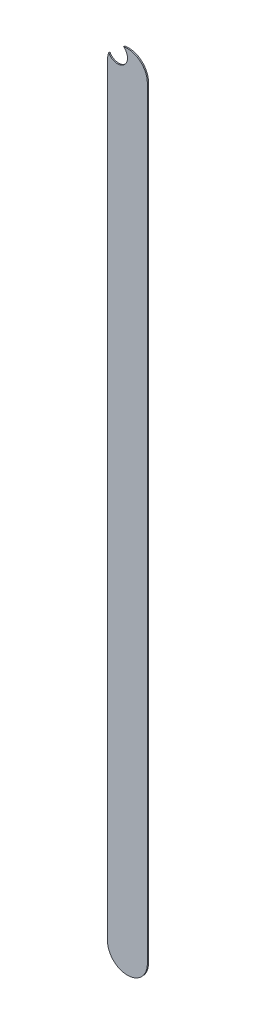
ISO-10303-21;
HEADER;
FILE_DESCRIPTION(('STEP AP214'),'2;1');
FILE_NAME('part.step','',(''),(''),'','','');
FILE_SCHEMA(('AUTOMOTIVE_DESIGN { 1 0 10303 214 1 1 1 1 }'));
ENDSEC;
DATA;
#1=APPLICATION_CONTEXT('core data for automotive mechanical design processes');
#2=APPLICATION_PROTOCOL_DEFINITION('international standard','automotive_design',2000,#1);
#3=PRODUCT_CONTEXT('',#1,'mechanical');
#4=PRODUCT('Part','Part','',(#3));
#5=PRODUCT_RELATED_PRODUCT_CATEGORY('part','',(#4));
#6=PRODUCT_DEFINITION_FORMATION('','',#4);
#7=PRODUCT_DEFINITION_CONTEXT('part definition',#1,'design');
#8=PRODUCT_DEFINITION('design','',#6,#7);
#9=PRODUCT_DEFINITION_SHAPE('','',#8);
#10=(LENGTH_UNIT() NAMED_UNIT(*) SI_UNIT(.MILLI.,.METRE.));
#11=(NAMED_UNIT(*) PLANE_ANGLE_UNIT() SI_UNIT($,.RADIAN.));
#12=(NAMED_UNIT(*) SI_UNIT($,.STERADIAN.) SOLID_ANGLE_UNIT());
#13=UNCERTAINTY_MEASURE_WITH_UNIT(LENGTH_MEASURE(1.E-05),#10,'distance_accuracy_value','');
#14=(GEOMETRIC_REPRESENTATION_CONTEXT(3) GLOBAL_UNCERTAINTY_ASSIGNED_CONTEXT((#13)) GLOBAL_UNIT_ASSIGNED_CONTEXT((#10,
#11,#12)) REPRESENTATION_CONTEXT('',''));
#15=CARTESIAN_POINT('',(0.,0.,0.));
#16=DIRECTION('',(0.,0.,1.));
#17=DIRECTION('',(1.,0.,0.));
#18=AXIS2_PLACEMENT_3D('',#15,#16,#17);
#19=CARTESIAN_POINT('',(84.29702724,72.67583636,0.));
#20=DIRECTION('',(-1.,0.,0.));
#21=DIRECTION('',(0.,1.,0.));
#22=AXIS2_PLACEMENT_3D('',#19,#20,#21);
#23=PLANE('',#22);
#24=DIRECTION('',(0.,1.,0.));
#25=VECTOR('',#24,1.);
#26=CARTESIAN_POINT('',(84.29702724,72.67583636,0.03556));
#27=LINE('',#26,#25);
#28=CARTESIAN_POINT('',(84.29702724,72.67583636,0.03556));
#29=VERTEX_POINT('',#28);
#30=CARTESIAN_POINT('',(84.29702724,95.64884858,0.03556));
#31=VERTEX_POINT('',#30);
#32=EDGE_CURVE('E11',#29,#31,#27,.T.);
#33=ORIENTED_EDGE('',*,*,#32,.F.);
#34=DIRECTION('',(0.,0.,1.));
#35=VECTOR('',#34,1.);
#36=CARTESIAN_POINT('',(84.29702724,72.67583636,0.));
#37=LINE('',#36,#35);
#38=CARTESIAN_POINT('',(84.29702724,72.67583636,0.));
#39=VERTEX_POINT('',#38);
#40=EDGE_CURVE('E24',#39,#29,#37,.T.);
#41=ORIENTED_EDGE('',*,*,#40,.F.);
#42=DIRECTION('',(0.,1.,0.));
#43=VECTOR('',#42,1.);
#44=CARTESIAN_POINT('',(84.29702724,72.67583636,0.));
#45=LINE('',#44,#43);
#46=CARTESIAN_POINT('',(84.29702724,95.64884858,0.));
#47=VERTEX_POINT('',#46);
#48=EDGE_CURVE('E94',#39,#47,#45,.T.);
#49=ORIENTED_EDGE('',*,*,#48,.T.);
#50=DIRECTION('',(0.,0.,1.));
#51=VECTOR('',#50,1.);
#52=CARTESIAN_POINT('',(84.29702724,95.64884858,0.));
#53=LINE('',#52,#51);
#54=EDGE_CURVE('E37',#47,#31,#53,.T.);
#55=ORIENTED_EDGE('',*,*,#54,.T.);
#56=EDGE_LOOP('',(#33,#41,#49,#55));
#57=FACE_BOUND('',#56,.T.);
#58=ADVANCED_FACE('F17',(#57),#23,.F.);
#59=CARTESIAN_POINT('',(83.69702844,95.64884858,0.));
#60=DIRECTION('',(0.,0.,-1.));
#61=DIRECTION('',(1.,0.,0.));
#62=AXIS2_PLACEMENT_3D('',#59,#60,#61);
#63=CYLINDRICAL_SURFACE('',#62,0.599998800000004);
#64=CARTESIAN_POINT('',(83.69702844,95.64884858,0.03556));
#65=DIRECTION('',(0.,0.,1.));
#66=DIRECTION('',(1.,0.,0.));
#67=AXIS2_PLACEMENT_3D('',#64,#65,#66);
#68=CIRCLE('',#67,0.599998800000004);
#69=CARTESIAN_POINT('',(83.5828000748852,96.2378735714941,0.03556));
#70=VERTEX_POINT('',#69);
#71=EDGE_CURVE('E123',#31,#70,#68,.T.);
#72=ORIENTED_EDGE('',*,*,#71,.F.);
#73=ORIENTED_EDGE('',*,*,#54,.F.);
#74=CARTESIAN_POINT('',(83.69702844,95.64884858,0.));
#75=DIRECTION('',(0.,0.,1.));
#76=DIRECTION('',(1.,0.,0.));
#77=AXIS2_PLACEMENT_3D('',#74,#75,#76);
#78=CIRCLE('',#77,0.599998800000004);
#79=CARTESIAN_POINT('',(83.5828000748852,96.2378735714941,0.));
#80=VERTEX_POINT('',#79);
#81=EDGE_CURVE('E120',#47,#80,#78,.T.);
#82=ORIENTED_EDGE('',*,*,#81,.T.);
#83=DIRECTION('',(0.,0.,1.));
#84=VECTOR('',#83,1.);
#85=CARTESIAN_POINT('',(83.5828000748852,96.2378735714941,0.));
#86=LINE('',#85,#84);
#87=EDGE_CURVE('E118',#80,#70,#86,.T.);
#88=ORIENTED_EDGE('',*,*,#87,.T.);
#89=EDGE_LOOP('',(#72,#73,#82,#88));
#90=FACE_BOUND('',#89,.T.);
#91=ADVANCED_FACE('F131',(#90),#63,.T.);
#92=CARTESIAN_POINT('',(83.3999856,96.0000112,0.));
#93=DIRECTION('',(0.,0.,-1.));
#94=DIRECTION('',(1.,0.,0.));
#95=AXIS2_PLACEMENT_3D('',#92,#93,#94);
#96=CYLINDRICAL_SURFACE('',#95,0.2999994);
#97=DIRECTION('',(0.,0.,1.));
#98=VECTOR('',#97,1.);
#99=CARTESIAN_POINT('',(83.699985,96.0000112,0.));
#100=LINE('',#99,#98);
#101=CARTESIAN_POINT('',(83.699985,96.0000112,0.));
#102=VERTEX_POINT('',#101);
#103=CARTESIAN_POINT('',(83.699985,96.0000112,0.03556));
#104=VERTEX_POINT('',#103);
#105=EDGE_CURVE('E116',#102,#104,#100,.T.);
#106=ORIENTED_EDGE('',*,*,#105,.T.);
#107=CARTESIAN_POINT('',(83.3999856,96.0000112,0.03556));
#108=DIRECTION('',(0.,0.,1.));
#109=DIRECTION('',(1.,0.,0.));
#110=AXIS2_PLACEMENT_3D('',#107,#108,#109);
#111=CIRCLE('',#110,0.2999994);
#112=EDGE_CURVE('E113',#104,#70,#111,.T.);
#113=ORIENTED_EDGE('',*,*,#112,.T.);
#114=ORIENTED_EDGE('',*,*,#87,.F.);
#115=CARTESIAN_POINT('',(83.3999856,96.0000112,0.));
#116=DIRECTION('',(0.,0.,1.));
#117=DIRECTION('',(1.,0.,0.));
#118=AXIS2_PLACEMENT_3D('',#115,#116,#117);
#119=CIRCLE('',#118,0.2999994);
#120=EDGE_CURVE('E110',#102,#80,#119,.T.);
#121=ORIENTED_EDGE('',*,*,#120,.F.);
#122=EDGE_LOOP('',(#106,#113,#114,#121));
#123=FACE_BOUND('',#122,.T.);
#124=ADVANCED_FACE('F137',(#123),#96,.F.);
#125=CARTESIAN_POINT('',(83.3999856,96.0000112,0.));
#126=DIRECTION('',(0.,0.,-1.));
#127=DIRECTION('',(1.,0.,0.));
#128=AXIS2_PLACEMENT_3D('',#125,#126,#127);
#129=CYLINDRICAL_SURFACE('',#128,0.2999994);
#130=DIRECTION('',(0.,0.,1.));
#131=VECTOR('',#130,1.);
#132=CARTESIAN_POINT('',(83.1351008260588,95.8591719422112,0.));
#133=LINE('',#132,#131);
#134=CARTESIAN_POINT('',(83.1351008260588,95.8591719422112,0.));
#135=VERTEX_POINT('',#134);
#136=CARTESIAN_POINT('',(83.1351008260588,95.8591719422112,0.03556));
#137=VERTEX_POINT('',#136);
#138=EDGE_CURVE('E108',#135,#137,#133,.T.);
#139=ORIENTED_EDGE('',*,*,#138,.T.);
#140=CARTESIAN_POINT('',(83.3999856,96.0000112,0.03556));
#141=DIRECTION('',(0.,0.,1.));
#142=DIRECTION('',(1.,0.,0.));
#143=AXIS2_PLACEMENT_3D('',#140,#141,#142);
#144=CIRCLE('',#143,0.2999994);
#145=EDGE_CURVE('E105',#137,#104,#144,.T.);
#146=ORIENTED_EDGE('',*,*,#145,.T.);
#147=ORIENTED_EDGE('',*,*,#105,.F.);
#148=EDGE_CURVE('E104',#135,#102,#119,.T.);
#149=ORIENTED_EDGE('',*,*,#148,.F.);
#150=EDGE_LOOP('',(#139,#146,#147,#149));
#151=FACE_BOUND('',#150,.T.);
#152=ADVANCED_FACE('F140',(#151),#129,.F.);
#153=CARTESIAN_POINT('',(83.69702844,95.64884858,0.));
#154=DIRECTION('',(0.,0.,-1.));
#155=DIRECTION('',(1.,0.,0.));
#156=AXIS2_PLACEMENT_3D('',#153,#154,#155);
#157=CYLINDRICAL_SURFACE('',#156,0.599998800000004);
#158=CARTESIAN_POINT('',(83.69702844,95.64884858,0.03556));
#159=DIRECTION('',(0.,0.,1.));
#160=DIRECTION('',(1.,0.,0.));
#161=AXIS2_PLACEMENT_3D('',#158,#159,#160);
#162=CIRCLE('',#161,0.599998800000004);
#163=CARTESIAN_POINT('',(83.09702964,95.64884858,0.03556));
#164=VERTEX_POINT('',#163);
#165=EDGE_CURVE('E101',#137,#164,#162,.T.);
#166=ORIENTED_EDGE('',*,*,#165,.F.);
#167=ORIENTED_EDGE('',*,*,#138,.F.);
#168=CARTESIAN_POINT('',(83.09702964,95.64884858,0.));
#169=VERTEX_POINT('',#168);
#170=EDGE_CURVE('E100',#135,#169,#78,.T.);
#171=ORIENTED_EDGE('',*,*,#170,.T.);
#172=DIRECTION('',(0.,0.,1.));
#173=VECTOR('',#172,1.);
#174=CARTESIAN_POINT('',(83.09702964,95.64884858,0.));
#175=LINE('',#174,#173);
#176=EDGE_CURVE('E85',#169,#164,#175,.T.);
#177=ORIENTED_EDGE('',*,*,#176,.T.);
#178=EDGE_LOOP('',(#166,#167,#171,#177));
#179=FACE_BOUND('',#178,.T.);
#180=ADVANCED_FACE('F143',(#179),#157,.T.);
#181=CARTESIAN_POINT('',(83.09702964,95.64884858,0.));
#182=DIRECTION('',(1.,0.,0.));
#183=DIRECTION('',(0.,-1.,0.));
#184=AXIS2_PLACEMENT_3D('',#181,#182,#183);
#185=PLANE('',#184);
#186=DIRECTION('',(0.,-1.,0.));
#187=VECTOR('',#186,1.);
#188=CARTESIAN_POINT('',(83.09702964,95.64884858,0.03556));
#189=LINE('',#188,#187);
#190=CARTESIAN_POINT('',(83.09702964,72.67583636,0.03556));
#191=VERTEX_POINT('',#190);
#192=EDGE_CURVE('E89',#164,#191,#189,.T.);
#193=ORIENTED_EDGE('',*,*,#192,.F.);
#194=ORIENTED_EDGE('',*,*,#176,.F.);
#195=DIRECTION('',(0.,-1.,0.));
#196=VECTOR('',#195,1.);
#197=CARTESIAN_POINT('',(83.09702964,95.64884858,0.));
#198=LINE('',#197,#196);
#199=CARTESIAN_POINT('',(83.09702964,72.67583636,0.));
#200=VERTEX_POINT('',#199);
#201=EDGE_CURVE('E81',#169,#200,#198,.T.);
#202=ORIENTED_EDGE('',*,*,#201,.T.);
#203=DIRECTION('',(0.,0.,1.));
#204=VECTOR('',#203,1.);
#205=CARTESIAN_POINT('',(83.09702964,72.67583636,0.));
#206=LINE('',#205,#204);
#207=EDGE_CURVE('E71',#200,#191,#206,.T.);
#208=ORIENTED_EDGE('',*,*,#207,.T.);
#209=EDGE_LOOP('',(#193,#194,#202,#208));
#210=FACE_BOUND('',#209,.T.);
#211=ADVANCED_FACE('F84',(#210),#185,.F.);
#212=CARTESIAN_POINT('',(83.69702844,72.67583636,0.));
#213=DIRECTION('',(0.,0.,-1.));
#214=DIRECTION('',(-1.,0.,0.));
#215=AXIS2_PLACEMENT_3D('',#212,#213,#214);
#216=CYLINDRICAL_SURFACE('',#215,0.599998799999999);
#217=CARTESIAN_POINT('',(83.69702844,72.67583636,0.03556));
#218=DIRECTION('',(0.,0.,1.));
#219=DIRECTION('',(-1.,0.,0.));
#220=AXIS2_PLACEMENT_3D('',#217,#218,#219);
#221=CIRCLE('',#220,0.599998799999999);
#222=EDGE_CURVE('E77',#191,#29,#221,.T.);
#223=ORIENTED_EDGE('',*,*,#222,.F.);
#224=ORIENTED_EDGE('',*,*,#207,.F.);
#225=CARTESIAN_POINT('',(83.69702844,72.67583636,0.));
#226=DIRECTION('',(0.,0.,1.));
#227=DIRECTION('',(-1.,0.,0.));
#228=AXIS2_PLACEMENT_3D('',#225,#226,#227);
#229=CIRCLE('',#228,0.599998799999999);
#230=EDGE_CURVE('E75',#200,#39,#229,.T.);
#231=ORIENTED_EDGE('',*,*,#230,.T.);
#232=ORIENTED_EDGE('',*,*,#40,.T.);
#233=EDGE_LOOP('',(#223,#224,#231,#232));
#234=FACE_BOUND('',#233,.T.);
#235=ADVANCED_FACE('F73',(#234),#216,.T.);
#236=CARTESIAN_POINT('',(84.29702724,72.67583636,0.));
#237=DIRECTION('',(0.,0.,-1.));
#238=DIRECTION('',(-1.,0.,0.));
#239=AXIS2_PLACEMENT_3D('',#236,#237,#238);
#240=PLANE('',#239);
#241=ORIENTED_EDGE('',*,*,#48,.F.);
#242=ORIENTED_EDGE('',*,*,#230,.F.);
#243=ORIENTED_EDGE('',*,*,#201,.F.);
#244=ORIENTED_EDGE('',*,*,#170,.F.);
#245=ORIENTED_EDGE('',*,*,#148,.T.);
#246=ORIENTED_EDGE('',*,*,#120,.T.);
#247=ORIENTED_EDGE('',*,*,#81,.F.);
#248=EDGE_LOOP('',(#241,#242,#243,#244,#245,#246,#247));
#249=FACE_BOUND('',#248,.T.);
#250=ADVANCED_FACE('F92',(#249),#240,.T.);
#251=CARTESIAN_POINT('',(84.29702724,72.67583636,0.03556));
#252=DIRECTION('',(0.,0.,-1.));
#253=DIRECTION('',(-1.,0.,0.));
#254=AXIS2_PLACEMENT_3D('',#251,#252,#253);
#255=PLANE('',#254);
#256=ORIENTED_EDGE('',*,*,#222,.T.);
#257=ORIENTED_EDGE('',*,*,#32,.T.);
#258=ORIENTED_EDGE('',*,*,#71,.T.);
#259=ORIENTED_EDGE('',*,*,#112,.F.);
#260=ORIENTED_EDGE('',*,*,#145,.F.);
#261=ORIENTED_EDGE('',*,*,#165,.T.);
#262=ORIENTED_EDGE('',*,*,#192,.T.);
#263=EDGE_LOOP('',(#256,#257,#258,#259,#260,#261,#262));
#264=FACE_BOUND('',#263,.T.);
#265=ADVANCED_FACE('F134',(#264),#255,.F.);
#266=CLOSED_SHELL('',(#58,#91,#124,#152,#180,#211,#235,#250,#265));
#267=MANIFOLD_SOLID_BREP('B1',#266);
#268=ADVANCED_BREP_SHAPE_REPRESENTATION('',(#18,#267),#14);
#269=SHAPE_DEFINITION_REPRESENTATION(#9,#268);
ENDSEC;
END-ISO-10303-21;
